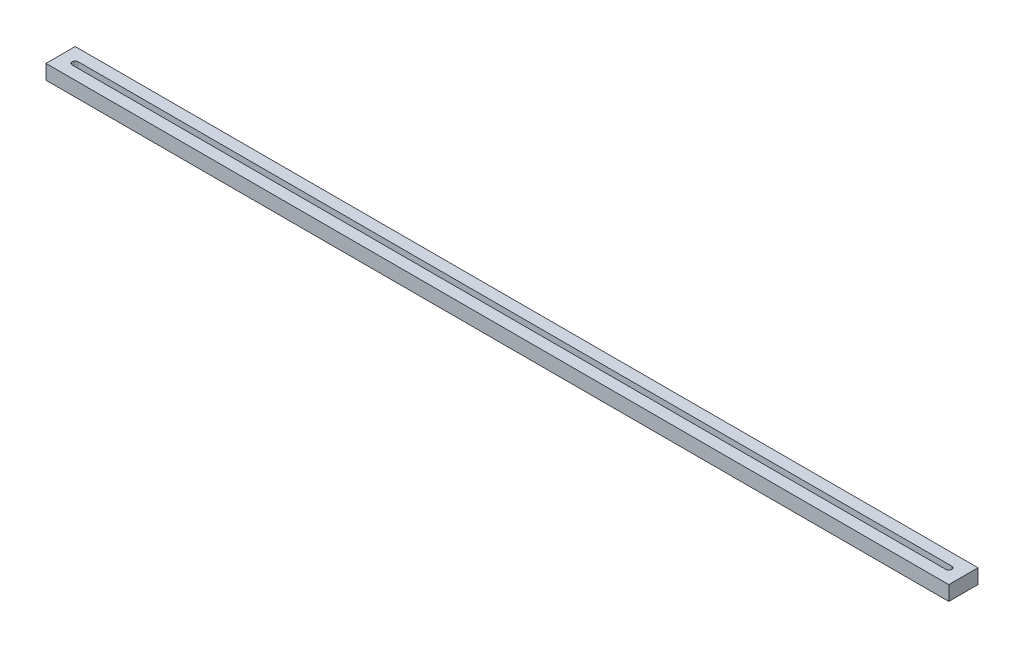
ISO-10303-21;
HEADER;
FILE_DESCRIPTION(('STEP AP214'),'2;1');
FILE_NAME('part.step','',(''),(''),'','','');
FILE_SCHEMA(('AUTOMOTIVE_DESIGN { 1 0 10303 214 1 1 1 1 }'));
ENDSEC;
DATA;
#1=APPLICATION_CONTEXT('core data for automotive mechanical design processes');
#2=APPLICATION_PROTOCOL_DEFINITION('international standard','automotive_design',2000,#1);
#3=PRODUCT_CONTEXT('',#1,'mechanical');
#4=PRODUCT('Part','Part','',(#3));
#5=PRODUCT_RELATED_PRODUCT_CATEGORY('part','',(#4));
#6=PRODUCT_DEFINITION_FORMATION('','',#4);
#7=PRODUCT_DEFINITION_CONTEXT('part definition',#1,'design');
#8=PRODUCT_DEFINITION('design','',#6,#7);
#9=PRODUCT_DEFINITION_SHAPE('','',#8);
#10=(LENGTH_UNIT() NAMED_UNIT(*) SI_UNIT(.MILLI.,.METRE.));
#11=(NAMED_UNIT(*) PLANE_ANGLE_UNIT() SI_UNIT($,.RADIAN.));
#12=(NAMED_UNIT(*) SI_UNIT($,.STERADIAN.) SOLID_ANGLE_UNIT());
#13=UNCERTAINTY_MEASURE_WITH_UNIT(LENGTH_MEASURE(1.E-05),#10,'distance_accuracy_value','');
#14=(GEOMETRIC_REPRESENTATION_CONTEXT(3) GLOBAL_UNCERTAINTY_ASSIGNED_CONTEXT((#13)) GLOBAL_UNIT_ASSIGNED_CONTEXT((#10,
#11,#12)) REPRESENTATION_CONTEXT('',''));
#15=CARTESIAN_POINT('',(0.,0.,0.));
#16=DIRECTION('',(0.,0.,1.));
#17=DIRECTION('',(1.,0.,0.));
#18=AXIS2_PLACEMENT_3D('',#15,#16,#17);
#19=CARTESIAN_POINT('',(0.,5.,0.));
#20=DIRECTION('',(0.,1.,0.));
#21=DIRECTION('',(0.,0.,1.));
#22=AXIS2_PLACEMENT_3D('',#19,#20,#21);
#23=PLANE('',#22);
#24=DIRECTION('',(0.,0.,1.));
#25=VECTOR('',#24,1.);
#26=CARTESIAN_POINT('',(10.475510873487,5.,-18.1185472496474));
#27=LINE('',#26,#25);
#28=CARTESIAN_POINT('',(10.475510873487,5.,-18.1185472496474));
#29=VERTEX_POINT('',#28);
#30=CARTESIAN_POINT('',(10.475510873487,5.,-8.1185472496474));
#31=VERTEX_POINT('',#30);
#32=EDGE_CURVE('E134',#29,#31,#27,.T.);
#33=ORIENTED_EDGE('',*,*,#32,.T.);
#34=DIRECTION('',(1.,0.,0.));
#35=VECTOR('',#34,1.);
#36=CARTESIAN_POINT('',(10.475510873487,5.,-8.1185472496474));
#37=LINE('',#36,#35);
#38=CARTESIAN_POINT('',(319.475510873487,5.,-8.1185472496474));
#39=VERTEX_POINT('',#38);
#40=EDGE_CURVE('E137',#31,#39,#37,.T.);
#41=ORIENTED_EDGE('',*,*,#40,.T.);
#42=DIRECTION('',(0.,0.,-1.));
#43=VECTOR('',#42,1.);
#44=CARTESIAN_POINT('',(319.475510873487,5.,-18.1185472496474));
#45=LINE('',#44,#43);
#46=CARTESIAN_POINT('',(319.475510873487,5.,-18.1185472496474));
#47=VERTEX_POINT('',#46);
#48=EDGE_CURVE('E140',#39,#47,#45,.T.);
#49=ORIENTED_EDGE('',*,*,#48,.T.);
#50=DIRECTION('',(-1.,0.,0.));
#51=VECTOR('',#50,1.);
#52=CARTESIAN_POINT('',(10.475510873487,5.,-18.1185472496474));
#53=LINE('',#52,#51);
#54=EDGE_CURVE('E142',#47,#29,#53,.T.);
#55=ORIENTED_EDGE('',*,*,#54,.T.);
#56=EDGE_LOOP('',(#33,#41,#49,#55));
#57=FACE_BOUND('',#56,.T.);
#58=DIRECTION('',(1.,0.,0.));
#59=VECTOR('',#58,1.);
#60=CARTESIAN_POINT('',(15.4755108734871,5.,-12.1185472496474));
#61=LINE('',#60,#59);
#62=CARTESIAN_POINT('',(15.4755108734871,5.,-12.1185472496474));
#63=VERTEX_POINT('',#62);
#64=CARTESIAN_POINT('',(314.475510873487,5.,-12.1185472496474));
#65=VERTEX_POINT('',#64);
#66=EDGE_CURVE('E106',#63,#65,#61,.T.);
#67=ORIENTED_EDGE('',*,*,#66,.F.);
#68=CARTESIAN_POINT('',(15.4755108734871,5.,-13.1185472496474));
#69=DIRECTION('',(0.,1.,0.));
#70=DIRECTION('',(0.,0.,1.));
#71=AXIS2_PLACEMENT_3D('',#68,#69,#70);
#72=CIRCLE('',#71,1.);
#73=CARTESIAN_POINT('',(15.4755108734871,5.,-14.1185472496474));
#74=VERTEX_POINT('',#73);
#75=EDGE_CURVE('E98',#74,#63,#72,.T.);
#76=ORIENTED_EDGE('',*,*,#75,.F.);
#77=DIRECTION('',(-1.,0.,0.));
#78=VECTOR('',#77,1.);
#79=CARTESIAN_POINT('',(15.4755108734871,5.,-14.1185472496474));
#80=LINE('',#79,#78);
#81=CARTESIAN_POINT('',(314.475510873487,5.,-14.1185472496474));
#82=VERTEX_POINT('',#81);
#83=EDGE_CURVE('E120',#82,#74,#80,.T.);
#84=ORIENTED_EDGE('',*,*,#83,.F.);
#85=CARTESIAN_POINT('',(314.475510873487,5.,-13.1185472496474));
#86=DIRECTION('',(0.,1.,0.));
#87=DIRECTION('',(0.,0.,1.));
#88=AXIS2_PLACEMENT_3D('',#85,#86,#87);
#89=CIRCLE('',#88,1.);
#90=EDGE_CURVE('E118',#65,#82,#89,.T.);
#91=ORIENTED_EDGE('',*,*,#90,.F.);
#92=EDGE_LOOP('',(#67,#76,#84,#91));
#93=FACE_BOUND('',#92,.T.);
#94=ADVANCED_FACE('F33',(#57,#93),#23,.T.);
#95=CARTESIAN_POINT('',(0.,0.,0.));
#96=DIRECTION('',(0.,1.,0.));
#97=DIRECTION('',(0.,0.,1.));
#98=AXIS2_PLACEMENT_3D('',#95,#96,#97);
#99=PLANE('',#98);
#100=DIRECTION('',(0.,0.,1.));
#101=VECTOR('',#100,1.);
#102=CARTESIAN_POINT('',(10.475510873487,0.,-18.1185472496474));
#103=LINE('',#102,#101);
#104=CARTESIAN_POINT('',(10.475510873487,0.,-18.1185472496474));
#105=VERTEX_POINT('',#104);
#106=CARTESIAN_POINT('',(10.475510873487,0.,-8.1185472496474));
#107=VERTEX_POINT('',#106);
#108=EDGE_CURVE('E114',#105,#107,#103,.T.);
#109=ORIENTED_EDGE('',*,*,#108,.F.);
#110=DIRECTION('',(-1.,0.,0.));
#111=VECTOR('',#110,1.);
#112=CARTESIAN_POINT('',(10.475510873487,0.,-18.1185472496474));
#113=LINE('',#112,#111);
#114=CARTESIAN_POINT('',(319.475510873487,0.,-18.1185472496474));
#115=VERTEX_POINT('',#114);
#116=EDGE_CURVE('E138',#115,#105,#113,.T.);
#117=ORIENTED_EDGE('',*,*,#116,.F.);
#118=DIRECTION('',(0.,0.,-1.));
#119=VECTOR('',#118,1.);
#120=CARTESIAN_POINT('',(319.475510873487,0.,-18.1185472496474));
#121=LINE('',#120,#119);
#122=CARTESIAN_POINT('',(319.475510873487,0.,-8.1185472496474));
#123=VERTEX_POINT('',#122);
#124=EDGE_CURVE('E149',#123,#115,#121,.T.);
#125=ORIENTED_EDGE('',*,*,#124,.F.);
#126=DIRECTION('',(1.,0.,0.));
#127=VECTOR('',#126,1.);
#128=CARTESIAN_POINT('',(10.475510873487,0.,-8.1185472496474));
#129=LINE('',#128,#127);
#130=EDGE_CURVE('E147',#107,#123,#129,.T.);
#131=ORIENTED_EDGE('',*,*,#130,.F.);
#132=EDGE_LOOP('',(#109,#117,#125,#131));
#133=FACE_BOUND('',#132,.T.);
#134=CARTESIAN_POINT('',(15.4755108734871,0.,-13.1185472496474));
#135=DIRECTION('',(0.,1.,0.));
#136=DIRECTION('',(0.,0.,1.));
#137=AXIS2_PLACEMENT_3D('',#134,#135,#136);
#138=CIRCLE('',#137,1.);
#139=CARTESIAN_POINT('',(15.4755108734871,0.,-14.1185472496474));
#140=VERTEX_POINT('',#139);
#141=CARTESIAN_POINT('',(15.4755108734871,0.,-12.1185472496474));
#142=VERTEX_POINT('',#141);
#143=EDGE_CURVE('E56',#140,#142,#138,.T.);
#144=ORIENTED_EDGE('',*,*,#143,.T.);
#145=DIRECTION('',(1.,0.,0.));
#146=VECTOR('',#145,1.);
#147=CARTESIAN_POINT('',(15.4755108734871,0.,-12.1185472496474));
#148=LINE('',#147,#146);
#149=CARTESIAN_POINT('',(314.475510873487,0.,-12.1185472496474));
#150=VERTEX_POINT('',#149);
#151=EDGE_CURVE('E113',#142,#150,#148,.T.);
#152=ORIENTED_EDGE('',*,*,#151,.T.);
#153=CARTESIAN_POINT('',(314.475510873487,0.,-13.1185472496474));
#154=DIRECTION('',(0.,1.,0.));
#155=DIRECTION('',(0.,0.,1.));
#156=AXIS2_PLACEMENT_3D('',#153,#154,#155);
#157=CIRCLE('',#156,1.);
#158=CARTESIAN_POINT('',(314.475510873487,0.,-14.1185472496474));
#159=VERTEX_POINT('',#158);
#160=EDGE_CURVE('E126',#150,#159,#157,.T.);
#161=ORIENTED_EDGE('',*,*,#160,.T.);
#162=DIRECTION('',(-1.,0.,0.));
#163=VECTOR('',#162,1.);
#164=CARTESIAN_POINT('',(15.4755108734871,0.,-14.1185472496474));
#165=LINE('',#164,#163);
#166=EDGE_CURVE('E107',#159,#140,#165,.T.);
#167=ORIENTED_EDGE('',*,*,#166,.T.);
#168=EDGE_LOOP('',(#144,#152,#161,#167));
#169=FACE_BOUND('',#168,.T.);
#170=ADVANCED_FACE('F167',(#133,#169),#99,.F.);
#171=CARTESIAN_POINT('',(10.475510873487,5.,-18.1185472496474));
#172=DIRECTION('',(1.,0.,0.));
#173=DIRECTION('',(0.,0.,-1.));
#174=AXIS2_PLACEMENT_3D('',#171,#172,#173);
#175=PLANE('',#174);
#176=ORIENTED_EDGE('',*,*,#108,.T.);
#177=DIRECTION('',(0.,-1.,0.));
#178=VECTOR('',#177,1.);
#179=CARTESIAN_POINT('',(10.475510873487,5.,-8.1185472496474));
#180=LINE('',#179,#178);
#181=EDGE_CURVE('E11',#31,#107,#180,.T.);
#182=ORIENTED_EDGE('',*,*,#181,.F.);
#183=ORIENTED_EDGE('',*,*,#32,.F.);
#184=DIRECTION('',(0.,-1.,0.));
#185=VECTOR('',#184,1.);
#186=CARTESIAN_POINT('',(10.475510873487,5.,-18.1185472496474));
#187=LINE('',#186,#185);
#188=EDGE_CURVE('E144',#29,#105,#187,.T.);
#189=ORIENTED_EDGE('',*,*,#188,.T.);
#190=EDGE_LOOP('',(#176,#182,#183,#189));
#191=FACE_BOUND('',#190,.T.);
#192=ADVANCED_FACE('F35',(#191),#175,.F.);
#193=CARTESIAN_POINT('',(10.475510873487,5.,-8.1185472496474));
#194=DIRECTION('',(0.,0.,-1.));
#195=DIRECTION('',(-1.,0.,0.));
#196=AXIS2_PLACEMENT_3D('',#193,#194,#195);
#197=PLANE('',#196);
#198=ORIENTED_EDGE('',*,*,#130,.T.);
#199=DIRECTION('',(0.,-1.,0.));
#200=VECTOR('',#199,1.);
#201=CARTESIAN_POINT('',(319.475510873487,5.,-8.1185472496474));
#202=LINE('',#201,#200);
#203=EDGE_CURVE('E41',#39,#123,#202,.T.);
#204=ORIENTED_EDGE('',*,*,#203,.F.);
#205=ORIENTED_EDGE('',*,*,#40,.F.);
#206=ORIENTED_EDGE('',*,*,#181,.T.);
#207=EDGE_LOOP('',(#198,#204,#205,#206));
#208=FACE_BOUND('',#207,.T.);
#209=ADVANCED_FACE('F177',(#208),#197,.F.);
#210=CARTESIAN_POINT('',(319.475510873487,5.,-18.1185472496474));
#211=DIRECTION('',(-1.,0.,0.));
#212=DIRECTION('',(0.,0.,1.));
#213=AXIS2_PLACEMENT_3D('',#210,#211,#212);
#214=PLANE('',#213);
#215=ORIENTED_EDGE('',*,*,#124,.T.);
#216=DIRECTION('',(0.,-1.,0.));
#217=VECTOR('',#216,1.);
#218=CARTESIAN_POINT('',(319.475510873487,5.,-18.1185472496474));
#219=LINE('',#218,#217);
#220=EDGE_CURVE('E154',#47,#115,#219,.T.);
#221=ORIENTED_EDGE('',*,*,#220,.F.);
#222=ORIENTED_EDGE('',*,*,#48,.F.);
#223=ORIENTED_EDGE('',*,*,#203,.T.);
#224=EDGE_LOOP('',(#215,#221,#222,#223));
#225=FACE_BOUND('',#224,.T.);
#226=ADVANCED_FACE('F161',(#225),#214,.F.);
#227=CARTESIAN_POINT('',(10.475510873487,5.,-18.1185472496474));
#228=DIRECTION('',(0.,0.,1.));
#229=DIRECTION('',(1.,0.,0.));
#230=AXIS2_PLACEMENT_3D('',#227,#228,#229);
#231=PLANE('',#230);
#232=ORIENTED_EDGE('',*,*,#116,.T.);
#233=ORIENTED_EDGE('',*,*,#188,.F.);
#234=ORIENTED_EDGE('',*,*,#54,.F.);
#235=ORIENTED_EDGE('',*,*,#220,.T.);
#236=EDGE_LOOP('',(#232,#233,#234,#235));
#237=FACE_BOUND('',#236,.T.);
#238=ADVANCED_FACE('F171',(#237),#231,.F.);
#239=CARTESIAN_POINT('',(15.4755108734871,5.,-13.1185472496474));
#240=DIRECTION('',(0.,-1.,0.));
#241=DIRECTION('',(0.,0.,-1.));
#242=AXIS2_PLACEMENT_3D('',#239,#240,#241);
#243=CYLINDRICAL_SURFACE('',#242,1.);
#244=ORIENTED_EDGE('',*,*,#143,.F.);
#245=DIRECTION('',(0.,-1.,0.));
#246=VECTOR('',#245,1.);
#247=CARTESIAN_POINT('',(15.4755108734871,5.,-14.1185472496474));
#248=LINE('',#247,#246);
#249=EDGE_CURVE('E102',#74,#140,#248,.T.);
#250=ORIENTED_EDGE('',*,*,#249,.F.);
#251=ORIENTED_EDGE('',*,*,#75,.T.);
#252=DIRECTION('',(0.,-1.,0.));
#253=VECTOR('',#252,1.);
#254=CARTESIAN_POINT('',(15.4755108734871,5.,-12.1185472496474));
#255=LINE('',#254,#253);
#256=EDGE_CURVE('E101',#63,#142,#255,.T.);
#257=ORIENTED_EDGE('',*,*,#256,.T.);
#258=EDGE_LOOP('',(#244,#250,#251,#257));
#259=FACE_BOUND('',#258,.T.);
#260=ADVANCED_FACE('F100',(#259),#243,.F.);
#261=CARTESIAN_POINT('',(15.4755108734871,5.,-12.1185472496474));
#262=DIRECTION('',(0.,0.,-1.));
#263=DIRECTION('',(-1.,0.,0.));
#264=AXIS2_PLACEMENT_3D('',#261,#262,#263);
#265=PLANE('',#264);
#266=ORIENTED_EDGE('',*,*,#151,.F.);
#267=ORIENTED_EDGE('',*,*,#256,.F.);
#268=ORIENTED_EDGE('',*,*,#66,.T.);
#269=DIRECTION('',(0.,-1.,0.));
#270=VECTOR('',#269,1.);
#271=CARTESIAN_POINT('',(314.475510873487,5.,-12.1185472496474));
#272=LINE('',#271,#270);
#273=EDGE_CURVE('E115',#65,#150,#272,.T.);
#274=ORIENTED_EDGE('',*,*,#273,.T.);
#275=EDGE_LOOP('',(#266,#267,#268,#274));
#276=FACE_BOUND('',#275,.T.);
#277=ADVANCED_FACE('F110',(#276),#265,.T.);
#278=CARTESIAN_POINT('',(314.475510873487,5.,-13.1185472496474));
#279=DIRECTION('',(0.,-1.,0.));
#280=DIRECTION('',(0.,0.,-1.));
#281=AXIS2_PLACEMENT_3D('',#278,#279,#280);
#282=CYLINDRICAL_SURFACE('',#281,1.);
#283=ORIENTED_EDGE('',*,*,#160,.F.);
#284=ORIENTED_EDGE('',*,*,#273,.F.);
#285=ORIENTED_EDGE('',*,*,#90,.T.);
#286=DIRECTION('',(0.,-1.,0.));
#287=VECTOR('',#286,1.);
#288=CARTESIAN_POINT('',(314.475510873487,5.,-14.1185472496474));
#289=LINE('',#288,#287);
#290=EDGE_CURVE('E48',#82,#159,#289,.T.);
#291=ORIENTED_EDGE('',*,*,#290,.T.);
#292=EDGE_LOOP('',(#283,#284,#285,#291));
#293=FACE_BOUND('',#292,.T.);
#294=ADVANCED_FACE('F200',(#293),#282,.F.);
#295=CARTESIAN_POINT('',(15.4755108734871,5.,-14.1185472496474));
#296=DIRECTION('',(0.,0.,1.));
#297=DIRECTION('',(1.,0.,0.));
#298=AXIS2_PLACEMENT_3D('',#295,#296,#297);
#299=PLANE('',#298);
#300=ORIENTED_EDGE('',*,*,#166,.F.);
#301=ORIENTED_EDGE('',*,*,#290,.F.);
#302=ORIENTED_EDGE('',*,*,#83,.T.);
#303=ORIENTED_EDGE('',*,*,#249,.T.);
#304=EDGE_LOOP('',(#300,#301,#302,#303));
#305=FACE_BOUND('',#304,.T.);
#306=ADVANCED_FACE('F204',(#305),#299,.T.);
#307=CLOSED_SHELL('',(#94,#170,#192,#209,#226,#238,#260,#277,#294,#306));
#308=MANIFOLD_SOLID_BREP('B2',#307);
#309=ADVANCED_BREP_SHAPE_REPRESENTATION('',(#18,#308),#14);
#310=SHAPE_DEFINITION_REPRESENTATION(#9,#309);
ENDSEC;
END-ISO-10303-21;
